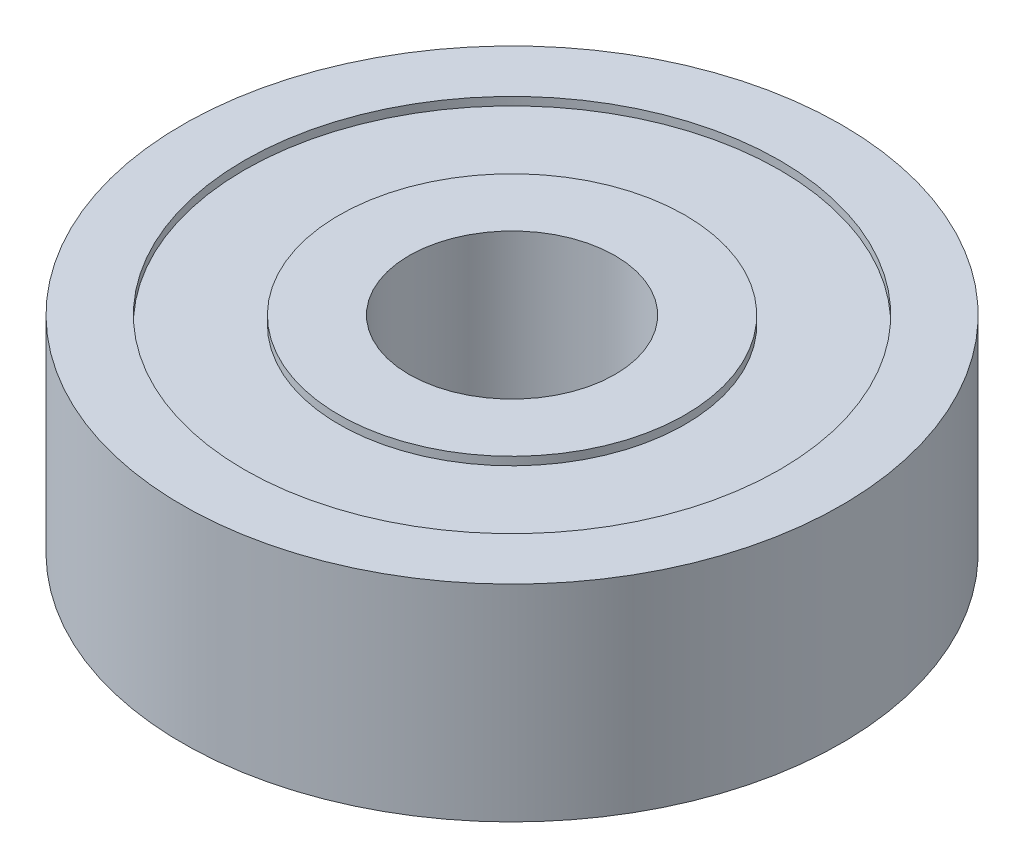
ISO-10303-21;
HEADER;
FILE_DESCRIPTION(('STEP AP214'),'2;1');
FILE_NAME('part.step','',(''),(''),'','','');
FILE_SCHEMA(('AUTOMOTIVE_DESIGN { 1 0 10303 214 1 1 1 1 }'));
ENDSEC;
DATA;
#1=APPLICATION_CONTEXT('core data for automotive mechanical design processes');
#2=APPLICATION_PROTOCOL_DEFINITION('international standard','automotive_design',2000,#1);
#3=PRODUCT_CONTEXT('',#1,'mechanical');
#4=PRODUCT('Part','Part','',(#3));
#5=PRODUCT_RELATED_PRODUCT_CATEGORY('part','',(#4));
#6=PRODUCT_DEFINITION_FORMATION('','',#4);
#7=PRODUCT_DEFINITION_CONTEXT('part definition',#1,'design');
#8=PRODUCT_DEFINITION('design','',#6,#7);
#9=PRODUCT_DEFINITION_SHAPE('','',#8);
#10=(LENGTH_UNIT() NAMED_UNIT(*) SI_UNIT(.MILLI.,.METRE.));
#11=(NAMED_UNIT(*) PLANE_ANGLE_UNIT() SI_UNIT($,.RADIAN.));
#12=(NAMED_UNIT(*) SI_UNIT($,.STERADIAN.) SOLID_ANGLE_UNIT());
#13=UNCERTAINTY_MEASURE_WITH_UNIT(LENGTH_MEASURE(1.E-05),#10,'distance_accuracy_value','');
#14=(GEOMETRIC_REPRESENTATION_CONTEXT(3) GLOBAL_UNCERTAINTY_ASSIGNED_CONTEXT((#13)) GLOBAL_UNIT_ASSIGNED_CONTEXT((#10,
#11,#12)) REPRESENTATION_CONTEXT('',''));
#15=CARTESIAN_POINT('',(0.,0.,0.));
#16=DIRECTION('',(0.,0.,1.));
#17=DIRECTION('',(1.,0.,0.));
#18=AXIS2_PLACEMENT_3D('',#15,#16,#17);
#19=CARTESIAN_POINT('',(0.,-2.5,0.));
#20=DIRECTION('',(0.,-1.,0.));
#21=DIRECTION('',(0.,0.,-1.));
#22=AXIS2_PLACEMENT_3D('',#19,#20,#21);
#23=CYLINDRICAL_SURFACE('',#22,6.5);
#24=CARTESIAN_POINT('',(0.,-2.5,0.));
#25=DIRECTION('',(0.,-1.,0.));
#26=DIRECTION('',(0.,0.,-1.));
#27=AXIS2_PLACEMENT_3D('',#24,#25,#26);
#28=CIRCLE('',#27,6.5);
#29=CARTESIAN_POINT('',(0.,-2.5,-6.5));
#30=VERTEX_POINT('',#29);
#31=EDGE_CURVE('E10',#30,#30,#28,.T.);
#32=ORIENTED_EDGE('',*,*,#31,.T.);
#33=EDGE_LOOP('',(#32));
#34=FACE_BOUND('',#33,.T.);
#35=CARTESIAN_POINT('',(0.,-2.3,0.));
#36=DIRECTION('',(0.,-1.,0.));
#37=DIRECTION('',(0.,0.,-1.));
#38=AXIS2_PLACEMENT_3D('',#35,#36,#37);
#39=CIRCLE('',#38,6.5);
#40=CARTESIAN_POINT('',(0.,-2.3,-6.5));
#41=VERTEX_POINT('',#40);
#42=EDGE_CURVE('E72',#41,#41,#39,.T.);
#43=ORIENTED_EDGE('',*,*,#42,.F.);
#44=EDGE_LOOP('',(#43));
#45=FACE_BOUND('',#44,.T.);
#46=ADVANCED_FACE('F32',(#34,#45),#23,.F.);
#47=CARTESIAN_POINT('',(6.5,-2.5,0.));
#48=DIRECTION('',(0.,-1.,0.));
#49=DIRECTION('',(0.,0.,-1.));
#50=AXIS2_PLACEMENT_3D('',#47,#48,#49);
#51=PLANE('',#50);
#52=CARTESIAN_POINT('',(0.,-2.5,0.));
#53=DIRECTION('',(0.,-1.,0.));
#54=DIRECTION('',(0.,0.,-1.));
#55=AXIS2_PLACEMENT_3D('',#52,#53,#54);
#56=CIRCLE('',#55,8.);
#57=CARTESIAN_POINT('',(0.,-2.5,-8.));
#58=VERTEX_POINT('',#57);
#59=EDGE_CURVE('E38',#58,#58,#56,.T.);
#60=ORIENTED_EDGE('',*,*,#59,.T.);
#61=EDGE_LOOP('',(#60));
#62=FACE_BOUND('',#61,.T.);
#63=ORIENTED_EDGE('',*,*,#31,.F.);
#64=EDGE_LOOP('',(#63));
#65=FACE_BOUND('',#64,.T.);
#66=ADVANCED_FACE('F80',(#62,#65),#51,.T.);
#67=CARTESIAN_POINT('',(0.,-2.5,0.));
#68=DIRECTION('',(0.,-1.,0.));
#69=DIRECTION('',(0.,0.,-1.));
#70=AXIS2_PLACEMENT_3D('',#67,#68,#69);
#71=CYLINDRICAL_SURFACE('',#70,8.);
#72=CARTESIAN_POINT('',(0.,2.5,0.));
#73=DIRECTION('',(0.,-1.,0.));
#74=DIRECTION('',(0.,0.,-1.));
#75=AXIS2_PLACEMENT_3D('',#72,#73,#74);
#76=CIRCLE('',#75,8.);
#77=CARTESIAN_POINT('',(0.,2.5,-8.));
#78=VERTEX_POINT('',#77);
#79=EDGE_CURVE('E42',#78,#78,#76,.T.);
#80=ORIENTED_EDGE('',*,*,#79,.T.);
#81=EDGE_LOOP('',(#80));
#82=FACE_BOUND('',#81,.T.);
#83=ORIENTED_EDGE('',*,*,#59,.F.);
#84=EDGE_LOOP('',(#83));
#85=FACE_BOUND('',#84,.T.);
#86=ADVANCED_FACE('F84',(#82,#85),#71,.T.);
#87=CARTESIAN_POINT('',(6.5,2.5,0.));
#88=DIRECTION('',(0.,1.,0.));
#89=DIRECTION('',(0.,0.,1.));
#90=AXIS2_PLACEMENT_3D('',#87,#88,#89);
#91=PLANE('',#90);
#92=CARTESIAN_POINT('',(0.,2.5,0.));
#93=DIRECTION('',(0.,-1.,0.));
#94=DIRECTION('',(0.,0.,-1.));
#95=AXIS2_PLACEMENT_3D('',#92,#93,#94);
#96=CIRCLE('',#95,6.5);
#97=CARTESIAN_POINT('',(0.,2.5,-6.5));
#98=VERTEX_POINT('',#97);
#99=EDGE_CURVE('E46',#98,#98,#96,.T.);
#100=ORIENTED_EDGE('',*,*,#99,.T.);
#101=EDGE_LOOP('',(#100));
#102=FACE_BOUND('',#101,.T.);
#103=ORIENTED_EDGE('',*,*,#79,.F.);
#104=EDGE_LOOP('',(#103));
#105=FACE_BOUND('',#104,.T.);
#106=ADVANCED_FACE('F88',(#102,#105),#91,.T.);
#107=CARTESIAN_POINT('',(0.,-2.5,0.));
#108=DIRECTION('',(0.,-1.,0.));
#109=DIRECTION('',(0.,0.,-1.));
#110=AXIS2_PLACEMENT_3D('',#107,#108,#109);
#111=CYLINDRICAL_SURFACE('',#110,6.5);
#112=CARTESIAN_POINT('',(0.,2.3,0.));
#113=DIRECTION('',(0.,-1.,0.));
#114=DIRECTION('',(0.,0.,-1.));
#115=AXIS2_PLACEMENT_3D('',#112,#113,#114);
#116=CIRCLE('',#115,6.5);
#117=CARTESIAN_POINT('',(0.,2.3,-6.5));
#118=VERTEX_POINT('',#117);
#119=EDGE_CURVE('E51',#118,#118,#116,.T.);
#120=ORIENTED_EDGE('',*,*,#119,.T.);
#121=EDGE_LOOP('',(#120));
#122=FACE_BOUND('',#121,.T.);
#123=ORIENTED_EDGE('',*,*,#99,.F.);
#124=EDGE_LOOP('',(#123));
#125=FACE_BOUND('',#124,.T.);
#126=ADVANCED_FACE('F95',(#122,#125),#111,.F.);
#127=CARTESIAN_POINT('',(4.2,2.3,0.));
#128=DIRECTION('',(0.,1.,0.));
#129=DIRECTION('',(0.,0.,1.));
#130=AXIS2_PLACEMENT_3D('',#127,#128,#129);
#131=PLANE('',#130);
#132=CARTESIAN_POINT('',(0.,2.3,0.));
#133=DIRECTION('',(0.,-1.,0.));
#134=DIRECTION('',(0.,0.,-1.));
#135=AXIS2_PLACEMENT_3D('',#132,#133,#134);
#136=CIRCLE('',#135,4.2);
#137=CARTESIAN_POINT('',(0.,2.3,-4.2));
#138=VERTEX_POINT('',#137);
#139=EDGE_CURVE('E54',#138,#138,#136,.T.);
#140=ORIENTED_EDGE('',*,*,#139,.T.);
#141=EDGE_LOOP('',(#140));
#142=FACE_BOUND('',#141,.T.);
#143=ORIENTED_EDGE('',*,*,#119,.F.);
#144=EDGE_LOOP('',(#143));
#145=FACE_BOUND('',#144,.T.);
#146=ADVANCED_FACE('F99',(#142,#145),#131,.T.);
#147=CARTESIAN_POINT('',(0.,-2.5,0.));
#148=DIRECTION('',(0.,-1.,0.));
#149=DIRECTION('',(0.,0.,-1.));
#150=AXIS2_PLACEMENT_3D('',#147,#148,#149);
#151=CYLINDRICAL_SURFACE('',#150,4.2);
#152=CARTESIAN_POINT('',(0.,2.5,0.));
#153=DIRECTION('',(0.,-1.,0.));
#154=DIRECTION('',(0.,0.,-1.));
#155=AXIS2_PLACEMENT_3D('',#152,#153,#154);
#156=CIRCLE('',#155,4.2);
#157=CARTESIAN_POINT('',(0.,2.5,-4.2));
#158=VERTEX_POINT('',#157);
#159=EDGE_CURVE('E57',#158,#158,#156,.T.);
#160=ORIENTED_EDGE('',*,*,#159,.T.);
#161=EDGE_LOOP('',(#160));
#162=FACE_BOUND('',#161,.T.);
#163=ORIENTED_EDGE('',*,*,#139,.F.);
#164=EDGE_LOOP('',(#163));
#165=FACE_BOUND('',#164,.T.);
#166=ADVANCED_FACE('F103',(#162,#165),#151,.T.);
#167=CARTESIAN_POINT('',(2.5,2.5,0.));
#168=DIRECTION('',(0.,1.,0.));
#169=DIRECTION('',(0.,0.,1.));
#170=AXIS2_PLACEMENT_3D('',#167,#168,#169);
#171=PLANE('',#170);
#172=CARTESIAN_POINT('',(0.,2.5,0.));
#173=DIRECTION('',(0.,-1.,0.));
#174=DIRECTION('',(0.,0.,-1.));
#175=AXIS2_PLACEMENT_3D('',#172,#173,#174);
#176=CIRCLE('',#175,2.5);
#177=CARTESIAN_POINT('',(0.,2.5,-2.5));
#178=VERTEX_POINT('',#177);
#179=EDGE_CURVE('E60',#178,#178,#176,.T.);
#180=ORIENTED_EDGE('',*,*,#179,.T.);
#181=EDGE_LOOP('',(#180));
#182=FACE_BOUND('',#181,.T.);
#183=ORIENTED_EDGE('',*,*,#159,.F.);
#184=EDGE_LOOP('',(#183));
#185=FACE_BOUND('',#184,.T.);
#186=ADVANCED_FACE('F107',(#182,#185),#171,.T.);
#187=CARTESIAN_POINT('',(0.,-2.5,0.));
#188=DIRECTION('',(0.,-1.,0.));
#189=DIRECTION('',(0.,0.,-1.));
#190=AXIS2_PLACEMENT_3D('',#187,#188,#189);
#191=CYLINDRICAL_SURFACE('',#190,2.5);
#192=CARTESIAN_POINT('',(0.,-2.5,0.));
#193=DIRECTION('',(0.,-1.,0.));
#194=DIRECTION('',(0.,0.,-1.));
#195=AXIS2_PLACEMENT_3D('',#192,#193,#194);
#196=CIRCLE('',#195,2.5);
#197=CARTESIAN_POINT('',(0.,-2.5,-2.5));
#198=VERTEX_POINT('',#197);
#199=EDGE_CURVE('E63',#198,#198,#196,.T.);
#200=ORIENTED_EDGE('',*,*,#199,.T.);
#201=EDGE_LOOP('',(#200));
#202=FACE_BOUND('',#201,.T.);
#203=ORIENTED_EDGE('',*,*,#179,.F.);
#204=EDGE_LOOP('',(#203));
#205=FACE_BOUND('',#204,.T.);
#206=ADVANCED_FACE('F111',(#202,#205),#191,.F.);
#207=CARTESIAN_POINT('',(2.5,-2.5,0.));
#208=DIRECTION('',(0.,-1.,0.));
#209=DIRECTION('',(0.,0.,-1.));
#210=AXIS2_PLACEMENT_3D('',#207,#208,#209);
#211=PLANE('',#210);
#212=CARTESIAN_POINT('',(0.,-2.5,0.));
#213=DIRECTION('',(0.,-1.,0.));
#214=DIRECTION('',(0.,0.,-1.));
#215=AXIS2_PLACEMENT_3D('',#212,#213,#214);
#216=CIRCLE('',#215,4.2);
#217=CARTESIAN_POINT('',(0.,-2.5,-4.2));
#218=VERTEX_POINT('',#217);
#219=EDGE_CURVE('E66',#218,#218,#216,.T.);
#220=ORIENTED_EDGE('',*,*,#219,.T.);
#221=EDGE_LOOP('',(#220));
#222=FACE_BOUND('',#221,.T.);
#223=ORIENTED_EDGE('',*,*,#199,.F.);
#224=EDGE_LOOP('',(#223));
#225=FACE_BOUND('',#224,.T.);
#226=ADVANCED_FACE('F115',(#222,#225),#211,.T.);
#227=CARTESIAN_POINT('',(0.,-2.5,0.));
#228=DIRECTION('',(0.,-1.,0.));
#229=DIRECTION('',(0.,0.,-1.));
#230=AXIS2_PLACEMENT_3D('',#227,#228,#229);
#231=CYLINDRICAL_SURFACE('',#230,4.2);
#232=CARTESIAN_POINT('',(0.,-2.3,0.));
#233=DIRECTION('',(0.,-1.,0.));
#234=DIRECTION('',(0.,0.,-1.));
#235=AXIS2_PLACEMENT_3D('',#232,#233,#234);
#236=CIRCLE('',#235,4.2);
#237=CARTESIAN_POINT('',(0.,-2.3,-4.2));
#238=VERTEX_POINT('',#237);
#239=EDGE_CURVE('E69',#238,#238,#236,.T.);
#240=ORIENTED_EDGE('',*,*,#239,.T.);
#241=EDGE_LOOP('',(#240));
#242=FACE_BOUND('',#241,.T.);
#243=ORIENTED_EDGE('',*,*,#219,.F.);
#244=EDGE_LOOP('',(#243));
#245=FACE_BOUND('',#244,.T.);
#246=ADVANCED_FACE('F119',(#242,#245),#231,.T.);
#247=CARTESIAN_POINT('',(4.2,-2.3,0.));
#248=DIRECTION('',(0.,-1.,0.));
#249=DIRECTION('',(0.,0.,-1.));
#250=AXIS2_PLACEMENT_3D('',#247,#248,#249);
#251=PLANE('',#250);
#252=ORIENTED_EDGE('',*,*,#42,.T.);
#253=EDGE_LOOP('',(#252));
#254=FACE_BOUND('',#253,.T.);
#255=ORIENTED_EDGE('',*,*,#239,.F.);
#256=EDGE_LOOP('',(#255));
#257=FACE_BOUND('',#256,.T.);
#258=ADVANCED_FACE('F76',(#254,#257),#251,.T.);
#259=CLOSED_SHELL('',(#46,#66,#86,#106,#126,#146,#166,#186,#206,#226,#246,#258));
#260=MANIFOLD_SOLID_BREP('B2',#259);
#261=ADVANCED_BREP_SHAPE_REPRESENTATION('',(#18,#260),#14);
#262=SHAPE_DEFINITION_REPRESENTATION(#9,#261);
ENDSEC;
END-ISO-10303-21;
